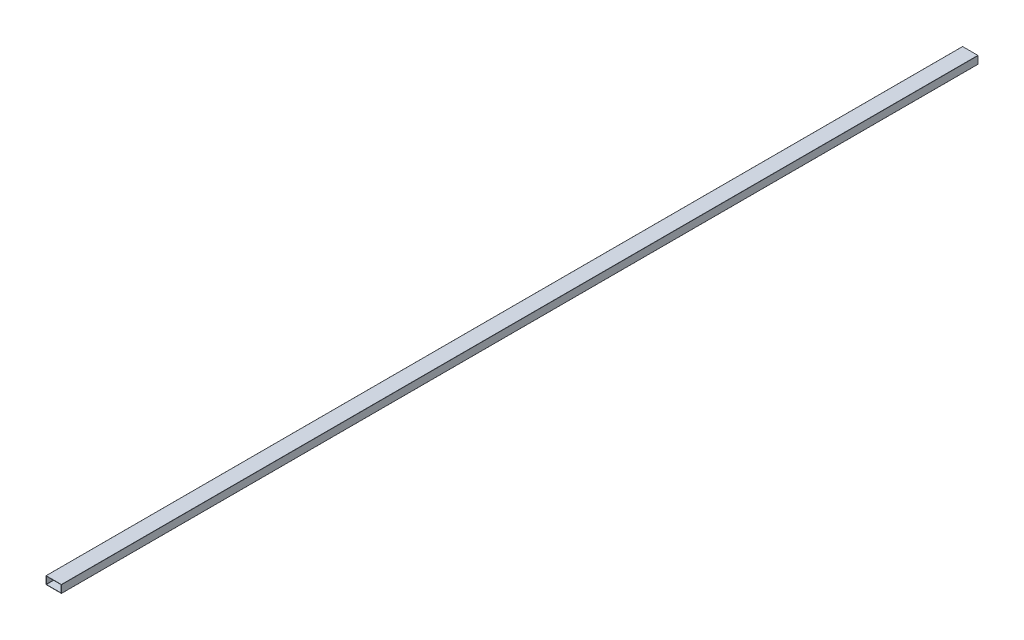
ISO-10303-21;
HEADER;
FILE_DESCRIPTION(('STEP AP214'),'2;1');
FILE_NAME('part.step','',(''),(''),'','','');
FILE_SCHEMA(('AUTOMOTIVE_DESIGN { 1 0 10303 214 1 1 1 1 }'));
ENDSEC;
DATA;
#1=APPLICATION_CONTEXT('core data for automotive mechanical design processes');
#2=APPLICATION_PROTOCOL_DEFINITION('international standard','automotive_design',2000,#1);
#3=PRODUCT_CONTEXT('',#1,'mechanical');
#4=PRODUCT('Part','Part','',(#3));
#5=PRODUCT_RELATED_PRODUCT_CATEGORY('part','',(#4));
#6=PRODUCT_DEFINITION_FORMATION('','',#4);
#7=PRODUCT_DEFINITION_CONTEXT('part definition',#1,'design');
#8=PRODUCT_DEFINITION('design','',#6,#7);
#9=PRODUCT_DEFINITION_SHAPE('','',#8);
#10=(LENGTH_UNIT() NAMED_UNIT(*) SI_UNIT(.MILLI.,.METRE.));
#11=(NAMED_UNIT(*) PLANE_ANGLE_UNIT() SI_UNIT($,.RADIAN.));
#12=(NAMED_UNIT(*) SI_UNIT($,.STERADIAN.) SOLID_ANGLE_UNIT());
#13=UNCERTAINTY_MEASURE_WITH_UNIT(LENGTH_MEASURE(1.E-05),#10,'distance_accuracy_value','');
#14=(GEOMETRIC_REPRESENTATION_CONTEXT(3) GLOBAL_UNCERTAINTY_ASSIGNED_CONTEXT((#13)) GLOBAL_UNIT_ASSIGNED_CONTEXT((#10,
#11,#12)) REPRESENTATION_CONTEXT('',''));
#15=CARTESIAN_POINT('',(0.,0.,0.));
#16=DIRECTION('',(0.,0.,1.));
#17=DIRECTION('',(1.,0.,0.));
#18=AXIS2_PLACEMENT_3D('',#15,#16,#17);
#19=CARTESIAN_POINT('',(50.8,-25.4,-6000.));
#20=DIRECTION('',(1.,0.,0.));
#21=DIRECTION('',(0.,0.,-1.));
#22=AXIS2_PLACEMENT_3D('',#19,#20,#21);
#23=PLANE('',#22);
#24=DIRECTION('',(0.,1.,0.));
#25=VECTOR('',#24,1.);
#26=CARTESIAN_POINT('',(50.8,-25.4,0.));
#27=LINE('',#26,#25);
#28=CARTESIAN_POINT('',(50.8,-24.4,0.));
#29=VERTEX_POINT('',#28);
#30=CARTESIAN_POINT('',(50.8,24.4,0.));
#31=VERTEX_POINT('',#30);
#32=EDGE_CURVE('E197',#29,#31,#27,.T.);
#33=ORIENTED_EDGE('',*,*,#32,.F.);
#34=DIRECTION('',(0.,0.,1.));
#35=VECTOR('',#34,1.);
#36=CARTESIAN_POINT('',(50.8,-24.4,-6000.));
#37=LINE('',#36,#35);
#38=CARTESIAN_POINT('',(50.8,-24.4,-6000.));
#39=VERTEX_POINT('',#38);
#40=EDGE_CURVE('E158',#29,#39,#37,.F.);
#41=ORIENTED_EDGE('',*,*,#40,.T.);
#42=DIRECTION('',(0.,1.,0.));
#43=VECTOR('',#42,1.);
#44=CARTESIAN_POINT('',(50.8,-25.4,-6000.));
#45=LINE('',#44,#43);
#46=CARTESIAN_POINT('',(50.8,24.4,-6000.));
#47=VERTEX_POINT('',#46);
#48=EDGE_CURVE('E185',#39,#47,#45,.T.);
#49=ORIENTED_EDGE('',*,*,#48,.T.);
#50=DIRECTION('',(0.,0.,1.));
#51=VECTOR('',#50,1.);
#52=CARTESIAN_POINT('',(50.8,24.4,-6000.));
#53=LINE('',#52,#51);
#54=EDGE_CURVE('E251',#47,#31,#53,.T.);
#55=ORIENTED_EDGE('',*,*,#54,.T.);
#56=EDGE_LOOP('',(#33,#41,#49,#55));
#57=FACE_BOUND('',#56,.T.);
#58=ADVANCED_FACE('F33',(#57),#23,.T.);
#59=CARTESIAN_POINT('',(-50.8,-25.4,-6000.));
#60=DIRECTION('',(0.,-1.,0.));
#61=DIRECTION('',(0.,0.,-1.));
#62=AXIS2_PLACEMENT_3D('',#59,#60,#61);
#63=PLANE('',#62);
#64=DIRECTION('',(1.,0.,0.));
#65=VECTOR('',#64,1.);
#66=CARTESIAN_POINT('',(-50.8,-25.4,0.));
#67=LINE('',#66,#65);
#68=CARTESIAN_POINT('',(-49.8,-25.4,0.));
#69=VERTEX_POINT('',#68);
#70=CARTESIAN_POINT('',(49.8,-25.4,0.));
#71=VERTEX_POINT('',#70);
#72=EDGE_CURVE('E189',#69,#71,#67,.T.);
#73=ORIENTED_EDGE('',*,*,#72,.F.);
#74=DIRECTION('',(0.,0.,1.));
#75=VECTOR('',#74,1.);
#76=CARTESIAN_POINT('',(-49.8,-25.4,-6000.));
#77=LINE('',#76,#75);
#78=CARTESIAN_POINT('',(-49.8,-25.4,-6000.));
#79=VERTEX_POINT('',#78);
#80=EDGE_CURVE('E238',#69,#79,#77,.F.);
#81=ORIENTED_EDGE('',*,*,#80,.T.);
#82=DIRECTION('',(1.,0.,0.));
#83=VECTOR('',#82,1.);
#84=CARTESIAN_POINT('',(-50.8,-25.4,-6000.));
#85=LINE('',#84,#83);
#86=CARTESIAN_POINT('',(49.8,-25.4,-6000.));
#87=VERTEX_POINT('',#86);
#88=EDGE_CURVE('E194',#79,#87,#85,.T.);
#89=ORIENTED_EDGE('',*,*,#88,.T.);
#90=DIRECTION('',(0.,0.,1.));
#91=VECTOR('',#90,1.);
#92=CARTESIAN_POINT('',(49.8,-25.4,-6000.));
#93=LINE('',#92,#91);
#94=EDGE_CURVE('E235',#87,#71,#93,.T.);
#95=ORIENTED_EDGE('',*,*,#94,.T.);
#96=EDGE_LOOP('',(#73,#81,#89,#95));
#97=FACE_BOUND('',#96,.T.);
#98=ADVANCED_FACE('F305',(#97),#63,.T.);
#99=CARTESIAN_POINT('',(-50.8,-25.4,-6000.));
#100=DIRECTION('',(-1.,0.,0.));
#101=DIRECTION('',(0.,0.,1.));
#102=AXIS2_PLACEMENT_3D('',#99,#100,#101);
#103=PLANE('',#102);
#104=DIRECTION('',(0.,-1.,0.));
#105=VECTOR('',#104,1.);
#106=CARTESIAN_POINT('',(-50.8,-25.4,-6000.));
#107=LINE('',#106,#105);
#108=CARTESIAN_POINT('',(-50.8,24.4,-6000.));
#109=VERTEX_POINT('',#108);
#110=CARTESIAN_POINT('',(-50.8,-24.4,-6000.));
#111=VERTEX_POINT('',#110);
#112=EDGE_CURVE('E191',#109,#111,#107,.T.);
#113=ORIENTED_EDGE('',*,*,#112,.T.);
#114=DIRECTION('',(0.,0.,1.));
#115=VECTOR('',#114,1.);
#116=CARTESIAN_POINT('',(-50.8,-24.4,-6000.));
#117=LINE('',#116,#115);
#118=CARTESIAN_POINT('',(-50.8,-24.4,0.));
#119=VERTEX_POINT('',#118);
#120=EDGE_CURVE('E224',#111,#119,#117,.T.);
#121=ORIENTED_EDGE('',*,*,#120,.T.);
#122=DIRECTION('',(0.,-1.,0.));
#123=VECTOR('',#122,1.);
#124=CARTESIAN_POINT('',(-50.8,-25.4,0.));
#125=LINE('',#124,#123);
#126=CARTESIAN_POINT('',(-50.8,24.4,0.));
#127=VERTEX_POINT('',#126);
#128=EDGE_CURVE('E203',#127,#119,#125,.T.);
#129=ORIENTED_EDGE('',*,*,#128,.F.);
#130=DIRECTION('',(0.,0.,1.));
#131=VECTOR('',#130,1.);
#132=CARTESIAN_POINT('',(-50.8,24.4,-6000.));
#133=LINE('',#132,#131);
#134=EDGE_CURVE('E222',#127,#109,#133,.F.);
#135=ORIENTED_EDGE('',*,*,#134,.T.);
#136=EDGE_LOOP('',(#113,#121,#129,#135));
#137=FACE_BOUND('',#136,.T.);
#138=ADVANCED_FACE('F311',(#137),#103,.T.);
#139=CARTESIAN_POINT('',(-50.8,25.4,-6000.));
#140=DIRECTION('',(0.,1.,0.));
#141=DIRECTION('',(0.,0.,1.));
#142=AXIS2_PLACEMENT_3D('',#139,#140,#141);
#143=PLANE('',#142);
#144=DIRECTION('',(-1.,0.,0.));
#145=VECTOR('',#144,1.);
#146=CARTESIAN_POINT('',(-50.8,25.4,-6000.));
#147=LINE('',#146,#145);
#148=CARTESIAN_POINT('',(49.8,25.4,-6000.));
#149=VERTEX_POINT('',#148);
#150=CARTESIAN_POINT('',(-49.8,25.4,-6000.));
#151=VERTEX_POINT('',#150);
#152=EDGE_CURVE('E188',#149,#151,#147,.T.);
#153=ORIENTED_EDGE('',*,*,#152,.T.);
#154=DIRECTION('',(0.,0.,1.));
#155=VECTOR('',#154,1.);
#156=CARTESIAN_POINT('',(-49.8,25.4,-6000.));
#157=LINE('',#156,#155);
#158=CARTESIAN_POINT('',(-49.8,25.4,0.));
#159=VERTEX_POINT('',#158);
#160=EDGE_CURVE('E248',#151,#159,#157,.T.);
#161=ORIENTED_EDGE('',*,*,#160,.T.);
#162=DIRECTION('',(-1.,0.,0.));
#163=VECTOR('',#162,1.);
#164=CARTESIAN_POINT('',(-50.8,25.4,0.));
#165=LINE('',#164,#163);
#166=CARTESIAN_POINT('',(49.8,25.4,0.));
#167=VERTEX_POINT('',#166);
#168=EDGE_CURVE('E200',#167,#159,#165,.T.);
#169=ORIENTED_EDGE('',*,*,#168,.F.);
#170=DIRECTION('',(0.,0.,1.));
#171=VECTOR('',#170,1.);
#172=CARTESIAN_POINT('',(49.8,25.4,-6000.));
#173=LINE('',#172,#171);
#174=EDGE_CURVE('E55',#167,#149,#173,.F.);
#175=ORIENTED_EDGE('',*,*,#174,.T.);
#176=EDGE_LOOP('',(#153,#161,#169,#175));
#177=FACE_BOUND('',#176,.T.);
#178=ADVANCED_FACE('F316',(#177),#143,.T.);
#179=CARTESIAN_POINT('',(0.,0.,-6000.));
#180=DIRECTION('',(0.,0.,-1.));
#181=DIRECTION('',(-1.,0.,0.));
#182=AXIS2_PLACEMENT_3D('',#179,#180,#181);
#183=PLANE('',#182);
#184=DIRECTION('',(0.,-1.,0.));
#185=VECTOR('',#184,1.);
#186=CARTESIAN_POINT('',(-48.91,-23.51,-6000.));
#187=LINE('',#186,#185);
#188=CARTESIAN_POINT('',(-48.91,22.51,-6000.));
#189=VERTEX_POINT('',#188);
#190=CARTESIAN_POINT('',(-48.91,-22.51,-6000.));
#191=VERTEX_POINT('',#190);
#192=EDGE_CURVE('E167',#189,#191,#187,.T.);
#193=ORIENTED_EDGE('',*,*,#192,.T.);
#194=CARTESIAN_POINT('',(-47.91,-22.51,-6000.));
#195=DIRECTION('',(0.,0.,-1.));
#196=DIRECTION('',(-1.,0.,0.));
#197=AXIS2_PLACEMENT_3D('',#194,#195,#196);
#198=CIRCLE('',#197,1.);
#199=CARTESIAN_POINT('',(-47.91,-23.51,-6000.));
#200=VERTEX_POINT('',#199);
#201=EDGE_CURVE('E11',#191,#200,#198,.F.);
#202=ORIENTED_EDGE('',*,*,#201,.T.);
#203=DIRECTION('',(1.,0.,0.));
#204=VECTOR('',#203,1.);
#205=CARTESIAN_POINT('',(-48.91,-23.51,-6000.));
#206=LINE('',#205,#204);
#207=CARTESIAN_POINT('',(47.91,-23.51,-6000.));
#208=VERTEX_POINT('',#207);
#209=EDGE_CURVE('E175',#200,#208,#206,.T.);
#210=ORIENTED_EDGE('',*,*,#209,.T.);
#211=CARTESIAN_POINT('',(47.91,-22.51,-6000.));
#212=DIRECTION('',(0.,0.,-1.));
#213=DIRECTION('',(-1.,0.,0.));
#214=AXIS2_PLACEMENT_3D('',#211,#212,#213);
#215=CIRCLE('',#214,1.);
#216=CARTESIAN_POINT('',(48.91,-22.51,-6000.));
#217=VERTEX_POINT('',#216);
#218=EDGE_CURVE('E262',#208,#217,#215,.F.);
#219=ORIENTED_EDGE('',*,*,#218,.T.);
#220=DIRECTION('',(0.,1.,0.));
#221=VECTOR('',#220,1.);
#222=CARTESIAN_POINT('',(48.91,-23.51,-6000.));
#223=LINE('',#222,#221);
#224=CARTESIAN_POINT('',(48.91,22.51,-6000.));
#225=VERTEX_POINT('',#224);
#226=EDGE_CURVE('E179',#217,#225,#223,.T.);
#227=ORIENTED_EDGE('',*,*,#226,.T.);
#228=CARTESIAN_POINT('',(47.91,22.51,-6000.));
#229=DIRECTION('',(0.,0.,-1.));
#230=DIRECTION('',(-1.,0.,0.));
#231=AXIS2_PLACEMENT_3D('',#228,#229,#230);
#232=CIRCLE('',#231,1.);
#233=CARTESIAN_POINT('',(47.91,23.51,-6000.));
#234=VERTEX_POINT('',#233);
#235=EDGE_CURVE('E258',#225,#234,#232,.F.);
#236=ORIENTED_EDGE('',*,*,#235,.T.);
#237=DIRECTION('',(-1.,0.,0.));
#238=VECTOR('',#237,1.);
#239=CARTESIAN_POINT('',(-48.91,23.51,-6000.));
#240=LINE('',#239,#238);
#241=CARTESIAN_POINT('',(-47.91,23.51,-6000.));
#242=VERTEX_POINT('',#241);
#243=EDGE_CURVE('E277',#234,#242,#240,.T.);
#244=ORIENTED_EDGE('',*,*,#243,.T.);
#245=CARTESIAN_POINT('',(-47.91,22.51,-6000.));
#246=DIRECTION('',(0.,0.,-1.));
#247=DIRECTION('',(-1.,0.,0.));
#248=AXIS2_PLACEMENT_3D('',#245,#246,#247);
#249=CIRCLE('',#248,1.);
#250=EDGE_CURVE('E157',#242,#189,#249,.F.);
#251=ORIENTED_EDGE('',*,*,#250,.T.);
#252=EDGE_LOOP('',(#193,#202,#210,#219,#227,#236,#244,#251));
#253=FACE_BOUND('',#252,.T.);
#254=ORIENTED_EDGE('',*,*,#88,.F.);
#255=CARTESIAN_POINT('',(-49.8,-24.4,-6000.));
#256=DIRECTION('',(0.,0.,-1.));
#257=DIRECTION('',(-1.,0.,0.));
#258=AXIS2_PLACEMENT_3D('',#255,#256,#257);
#259=CIRCLE('',#258,1.);
#260=EDGE_CURVE('E245',#79,#111,#259,.T.);
#261=ORIENTED_EDGE('',*,*,#260,.T.);
#262=ORIENTED_EDGE('',*,*,#112,.F.);
#263=CARTESIAN_POINT('',(-49.8,24.4,-6000.));
#264=DIRECTION('',(0.,0.,-1.));
#265=DIRECTION('',(-1.,0.,0.));
#266=AXIS2_PLACEMENT_3D('',#263,#264,#265);
#267=CIRCLE('',#266,1.);
#268=EDGE_CURVE('E48',#109,#151,#267,.T.);
#269=ORIENTED_EDGE('',*,*,#268,.T.);
#270=ORIENTED_EDGE('',*,*,#152,.F.);
#271=CARTESIAN_POINT('',(49.8,24.4,-6000.));
#272=DIRECTION('',(0.,0.,-1.));
#273=DIRECTION('',(-1.,0.,0.));
#274=AXIS2_PLACEMENT_3D('',#271,#272,#273);
#275=CIRCLE('',#274,1.);
#276=EDGE_CURVE('E240',#149,#47,#275,.T.);
#277=ORIENTED_EDGE('',*,*,#276,.T.);
#278=ORIENTED_EDGE('',*,*,#48,.F.);
#279=CARTESIAN_POINT('',(49.8,-24.4,-6000.));
#280=DIRECTION('',(0.,0.,-1.));
#281=DIRECTION('',(-1.,0.,0.));
#282=AXIS2_PLACEMENT_3D('',#279,#280,#281);
#283=CIRCLE('',#282,1.);
#284=EDGE_CURVE('E242',#39,#87,#283,.T.);
#285=ORIENTED_EDGE('',*,*,#284,.T.);
#286=EDGE_LOOP('',(#254,#261,#262,#269,#270,#277,#278,#285));
#287=FACE_BOUND('',#286,.T.);
#288=ADVANCED_FACE('F267',(#253,#287),#183,.T.);
#289=CARTESIAN_POINT('',(0.,0.,0.));
#290=DIRECTION('',(0.,0.,-1.));
#291=DIRECTION('',(-1.,0.,0.));
#292=AXIS2_PLACEMENT_3D('',#289,#290,#291);
#293=PLANE('',#292);
#294=DIRECTION('',(0.,1.,0.));
#295=VECTOR('',#294,1.);
#296=CARTESIAN_POINT('',(48.91,-23.51,0.));
#297=LINE('',#296,#295);
#298=CARTESIAN_POINT('',(48.91,-22.51,0.));
#299=VERTEX_POINT('',#298);
#300=CARTESIAN_POINT('',(48.91,22.51,0.));
#301=VERTEX_POINT('',#300);
#302=EDGE_CURVE('E181',#299,#301,#297,.T.);
#303=ORIENTED_EDGE('',*,*,#302,.F.);
#304=CARTESIAN_POINT('',(47.91,-22.51,0.));
#305=DIRECTION('',(0.,0.,-1.));
#306=DIRECTION('',(-1.,0.,0.));
#307=AXIS2_PLACEMENT_3D('',#304,#305,#306);
#308=CIRCLE('',#307,1.);
#309=CARTESIAN_POINT('',(47.91,-23.51,0.));
#310=VERTEX_POINT('',#309);
#311=EDGE_CURVE('E260',#299,#310,#308,.T.);
#312=ORIENTED_EDGE('',*,*,#311,.T.);
#313=DIRECTION('',(1.,0.,0.));
#314=VECTOR('',#313,1.);
#315=CARTESIAN_POINT('',(-48.91,-23.51,0.));
#316=LINE('',#315,#314);
#317=CARTESIAN_POINT('',(-47.91,-23.51,0.));
#318=VERTEX_POINT('',#317);
#319=EDGE_CURVE('E281',#318,#310,#316,.T.);
#320=ORIENTED_EDGE('',*,*,#319,.F.);
#321=CARTESIAN_POINT('',(-47.91,-22.51,0.));
#322=DIRECTION('',(0.,0.,-1.));
#323=DIRECTION('',(-1.,0.,0.));
#324=AXIS2_PLACEMENT_3D('',#321,#322,#323);
#325=CIRCLE('',#324,1.);
#326=CARTESIAN_POINT('',(-48.91,-22.51,0.));
#327=VERTEX_POINT('',#326);
#328=EDGE_CURVE('E41',#318,#327,#325,.T.);
#329=ORIENTED_EDGE('',*,*,#328,.T.);
#330=DIRECTION('',(0.,-1.,0.));
#331=VECTOR('',#330,1.);
#332=CARTESIAN_POINT('',(-48.91,-23.51,0.));
#333=LINE('',#332,#331);
#334=CARTESIAN_POINT('',(-48.91,22.51,0.));
#335=VERTEX_POINT('',#334);
#336=EDGE_CURVE('E164',#335,#327,#333,.T.);
#337=ORIENTED_EDGE('',*,*,#336,.F.);
#338=CARTESIAN_POINT('',(-47.91,22.51,0.));
#339=DIRECTION('',(0.,0.,-1.));
#340=DIRECTION('',(-1.,0.,0.));
#341=AXIS2_PLACEMENT_3D('',#338,#339,#340);
#342=CIRCLE('',#341,1.);
#343=CARTESIAN_POINT('',(-47.91,23.51,0.));
#344=VERTEX_POINT('',#343);
#345=EDGE_CURVE('E147',#335,#344,#342,.T.);
#346=ORIENTED_EDGE('',*,*,#345,.T.);
#347=DIRECTION('',(-1.,0.,0.));
#348=VECTOR('',#347,1.);
#349=CARTESIAN_POINT('',(-48.91,23.51,0.));
#350=LINE('',#349,#348);
#351=CARTESIAN_POINT('',(47.91,23.51,0.));
#352=VERTEX_POINT('',#351);
#353=EDGE_CURVE('E176',#352,#344,#350,.T.);
#354=ORIENTED_EDGE('',*,*,#353,.F.);
#355=CARTESIAN_POINT('',(47.91,22.51,0.));
#356=DIRECTION('',(0.,0.,-1.));
#357=DIRECTION('',(-1.,0.,0.));
#358=AXIS2_PLACEMENT_3D('',#355,#356,#357);
#359=CIRCLE('',#358,1.);
#360=EDGE_CURVE('E256',#352,#301,#359,.T.);
#361=ORIENTED_EDGE('',*,*,#360,.T.);
#362=EDGE_LOOP('',(#303,#312,#320,#329,#337,#346,#354,#361));
#363=FACE_BOUND('',#362,.T.);
#364=ORIENTED_EDGE('',*,*,#128,.T.);
#365=CARTESIAN_POINT('',(-49.8,-24.4,0.));
#366=DIRECTION('',(0.,0.,-1.));
#367=DIRECTION('',(-1.,0.,0.));
#368=AXIS2_PLACEMENT_3D('',#365,#366,#367);
#369=CIRCLE('',#368,1.);
#370=EDGE_CURVE('E233',#119,#69,#369,.F.);
#371=ORIENTED_EDGE('',*,*,#370,.T.);
#372=ORIENTED_EDGE('',*,*,#72,.T.);
#373=CARTESIAN_POINT('',(49.8,-24.4,0.));
#374=DIRECTION('',(0.,0.,-1.));
#375=DIRECTION('',(-1.,0.,0.));
#376=AXIS2_PLACEMENT_3D('',#373,#374,#375);
#377=CIRCLE('',#376,1.);
#378=EDGE_CURVE('E229',#71,#29,#377,.F.);
#379=ORIENTED_EDGE('',*,*,#378,.T.);
#380=ORIENTED_EDGE('',*,*,#32,.T.);
#381=CARTESIAN_POINT('',(49.8,24.4,0.));
#382=DIRECTION('',(0.,0.,-1.));
#383=DIRECTION('',(-1.,0.,0.));
#384=AXIS2_PLACEMENT_3D('',#381,#382,#383);
#385=CIRCLE('',#384,1.);
#386=EDGE_CURVE('E227',#31,#167,#385,.F.);
#387=ORIENTED_EDGE('',*,*,#386,.T.);
#388=ORIENTED_EDGE('',*,*,#168,.T.);
#389=CARTESIAN_POINT('',(-49.8,24.4,0.));
#390=DIRECTION('',(0.,0.,-1.));
#391=DIRECTION('',(-1.,0.,0.));
#392=AXIS2_PLACEMENT_3D('',#389,#390,#391);
#393=CIRCLE('',#392,1.);
#394=EDGE_CURVE('E231',#159,#127,#393,.F.);
#395=ORIENTED_EDGE('',*,*,#394,.T.);
#396=EDGE_LOOP('',(#364,#371,#372,#379,#380,#387,#388,#395));
#397=FACE_BOUND('',#396,.T.);
#398=ADVANCED_FACE('F172',(#363,#397),#293,.F.);
#399=CARTESIAN_POINT('',(-48.91,-23.51,-6000.));
#400=DIRECTION('',(0.,-1.,0.));
#401=DIRECTION('',(0.,0.,-1.));
#402=AXIS2_PLACEMENT_3D('',#399,#400,#401);
#403=PLANE('',#402);
#404=ORIENTED_EDGE('',*,*,#319,.T.);
#405=DIRECTION('',(0.,0.,1.));
#406=VECTOR('',#405,1.);
#407=CARTESIAN_POINT('',(47.91,-23.51,-6000.));
#408=LINE('',#407,#406);
#409=EDGE_CURVE('E220',#310,#208,#408,.F.);
#410=ORIENTED_EDGE('',*,*,#409,.T.);
#411=ORIENTED_EDGE('',*,*,#209,.F.);
#412=DIRECTION('',(0.,0.,1.));
#413=VECTOR('',#412,1.);
#414=CARTESIAN_POINT('',(-47.91,-23.51,0.));
#415=LINE('',#414,#413);
#416=EDGE_CURVE('E217',#200,#318,#415,.T.);
#417=ORIENTED_EDGE('',*,*,#416,.T.);
#418=EDGE_LOOP('',(#404,#410,#411,#417));
#419=FACE_BOUND('',#418,.T.);
#420=ADVANCED_FACE('F283',(#419),#403,.F.);
#421=CARTESIAN_POINT('',(-48.91,-23.51,-6000.));
#422=DIRECTION('',(-1.,0.,0.));
#423=DIRECTION('',(0.,0.,1.));
#424=AXIS2_PLACEMENT_3D('',#421,#422,#423);
#425=PLANE('',#424);
#426=ORIENTED_EDGE('',*,*,#192,.F.);
#427=DIRECTION('',(0.,0.,1.));
#428=VECTOR('',#427,1.);
#429=CARTESIAN_POINT('',(-48.91,22.51,0.));
#430=LINE('',#429,#428);
#431=EDGE_CURVE('E151',#189,#335,#430,.T.);
#432=ORIENTED_EDGE('',*,*,#431,.T.);
#433=ORIENTED_EDGE('',*,*,#336,.T.);
#434=DIRECTION('',(0.,0.,1.));
#435=VECTOR('',#434,1.);
#436=CARTESIAN_POINT('',(-48.91,-22.51,-6000.));
#437=LINE('',#436,#435);
#438=EDGE_CURVE('E169',#327,#191,#437,.F.);
#439=ORIENTED_EDGE('',*,*,#438,.T.);
#440=EDGE_LOOP('',(#426,#432,#433,#439));
#441=FACE_BOUND('',#440,.T.);
#442=ADVANCED_FACE('F163',(#441),#425,.F.);
#443=CARTESIAN_POINT('',(-48.91,23.51,-6000.));
#444=DIRECTION('',(0.,1.,0.));
#445=DIRECTION('',(0.,0.,1.));
#446=AXIS2_PLACEMENT_3D('',#443,#444,#445);
#447=PLANE('',#446);
#448=ORIENTED_EDGE('',*,*,#353,.T.);
#449=DIRECTION('',(0.,0.,1.));
#450=VECTOR('',#449,1.);
#451=CARTESIAN_POINT('',(-47.91,23.51,-6000.));
#452=LINE('',#451,#450);
#453=EDGE_CURVE('E152',#344,#242,#452,.F.);
#454=ORIENTED_EDGE('',*,*,#453,.T.);
#455=ORIENTED_EDGE('',*,*,#243,.F.);
#456=DIRECTION('',(0.,0.,1.));
#457=VECTOR('',#456,1.);
#458=CARTESIAN_POINT('',(47.91,23.51,0.));
#459=LINE('',#458,#457);
#460=EDGE_CURVE('E168',#234,#352,#459,.T.);
#461=ORIENTED_EDGE('',*,*,#460,.T.);
#462=EDGE_LOOP('',(#448,#454,#455,#461));
#463=FACE_BOUND('',#462,.T.);
#464=ADVANCED_FACE('F292',(#463),#447,.F.);
#465=CARTESIAN_POINT('',(48.91,-23.51,-6000.));
#466=DIRECTION('',(1.,0.,0.));
#467=DIRECTION('',(0.,0.,-1.));
#468=AXIS2_PLACEMENT_3D('',#465,#466,#467);
#469=PLANE('',#468);
#470=ORIENTED_EDGE('',*,*,#302,.T.);
#471=DIRECTION('',(0.,0.,1.));
#472=VECTOR('',#471,1.);
#473=CARTESIAN_POINT('',(48.91,22.51,-6000.));
#474=LINE('',#473,#472);
#475=EDGE_CURVE('E215',#301,#225,#474,.F.);
#476=ORIENTED_EDGE('',*,*,#475,.T.);
#477=ORIENTED_EDGE('',*,*,#226,.F.);
#478=DIRECTION('',(0.,0.,1.));
#479=VECTOR('',#478,1.);
#480=CARTESIAN_POINT('',(48.91,-22.51,0.));
#481=LINE('',#480,#479);
#482=EDGE_CURVE('E212',#217,#299,#481,.T.);
#483=ORIENTED_EDGE('',*,*,#482,.T.);
#484=EDGE_LOOP('',(#470,#476,#477,#483));
#485=FACE_BOUND('',#484,.T.);
#486=ADVANCED_FACE('F275',(#485),#469,.F.);
#487=CARTESIAN_POINT('',(-47.91,22.51,-6000.));
#488=DIRECTION('',(0.,0.,-1.));
#489=DIRECTION('',(-1.,0.,0.));
#490=AXIS2_PLACEMENT_3D('',#487,#488,#489);
#491=CYLINDRICAL_SURFACE('',#490,1.);
#492=ORIENTED_EDGE('',*,*,#250,.F.);
#493=ORIENTED_EDGE('',*,*,#453,.F.);
#494=ORIENTED_EDGE('',*,*,#345,.F.);
#495=ORIENTED_EDGE('',*,*,#431,.F.);
#496=EDGE_LOOP('',(#492,#493,#494,#495));
#497=FACE_BOUND('',#496,.T.);
#498=ADVANCED_FACE('F150',(#497),#491,.F.);
#499=CARTESIAN_POINT('',(47.91,22.51,-6000.));
#500=DIRECTION('',(0.,0.,-1.));
#501=DIRECTION('',(-1.,0.,0.));
#502=AXIS2_PLACEMENT_3D('',#499,#500,#501);
#503=CYLINDRICAL_SURFACE('',#502,1.);
#504=ORIENTED_EDGE('',*,*,#235,.F.);
#505=ORIENTED_EDGE('',*,*,#475,.F.);
#506=ORIENTED_EDGE('',*,*,#360,.F.);
#507=ORIENTED_EDGE('',*,*,#460,.F.);
#508=EDGE_LOOP('',(#504,#505,#506,#507));
#509=FACE_BOUND('',#508,.T.);
#510=ADVANCED_FACE('F294',(#509),#503,.F.);
#511=CARTESIAN_POINT('',(47.91,-22.51,-6000.));
#512=DIRECTION('',(0.,0.,-1.));
#513=DIRECTION('',(-1.,0.,0.));
#514=AXIS2_PLACEMENT_3D('',#511,#512,#513);
#515=CYLINDRICAL_SURFACE('',#514,1.);
#516=ORIENTED_EDGE('',*,*,#218,.F.);
#517=ORIENTED_EDGE('',*,*,#409,.F.);
#518=ORIENTED_EDGE('',*,*,#311,.F.);
#519=ORIENTED_EDGE('',*,*,#482,.F.);
#520=EDGE_LOOP('',(#516,#517,#518,#519));
#521=FACE_BOUND('',#520,.T.);
#522=ADVANCED_FACE('F279',(#521),#515,.F.);
#523=CARTESIAN_POINT('',(-49.8,-24.4,-6000.));
#524=DIRECTION('',(0.,0.,1.));
#525=DIRECTION('',(1.,0.,0.));
#526=AXIS2_PLACEMENT_3D('',#523,#524,#525);
#527=CYLINDRICAL_SURFACE('',#526,1.);
#528=ORIENTED_EDGE('',*,*,#260,.F.);
#529=ORIENTED_EDGE('',*,*,#80,.F.);
#530=ORIENTED_EDGE('',*,*,#370,.F.);
#531=ORIENTED_EDGE('',*,*,#120,.F.);
#532=EDGE_LOOP('',(#528,#529,#530,#531));
#533=FACE_BOUND('',#532,.T.);
#534=ADVANCED_FACE('F301',(#533),#527,.T.);
#535=CARTESIAN_POINT('',(-49.8,24.4,-6000.));
#536=DIRECTION('',(0.,0.,1.));
#537=DIRECTION('',(1.,0.,0.));
#538=AXIS2_PLACEMENT_3D('',#535,#536,#537);
#539=CYLINDRICAL_SURFACE('',#538,1.);
#540=ORIENTED_EDGE('',*,*,#268,.F.);
#541=ORIENTED_EDGE('',*,*,#134,.F.);
#542=ORIENTED_EDGE('',*,*,#394,.F.);
#543=ORIENTED_EDGE('',*,*,#160,.F.);
#544=EDGE_LOOP('',(#540,#541,#542,#543));
#545=FACE_BOUND('',#544,.T.);
#546=ADVANCED_FACE('F368',(#545),#539,.T.);
#547=CARTESIAN_POINT('',(-47.91,-22.51,-6000.));
#548=DIRECTION('',(0.,0.,-1.));
#549=DIRECTION('',(-1.,0.,0.));
#550=AXIS2_PLACEMENT_3D('',#547,#548,#549);
#551=CYLINDRICAL_SURFACE('',#550,1.);
#552=ORIENTED_EDGE('',*,*,#201,.F.);
#553=ORIENTED_EDGE('',*,*,#438,.F.);
#554=ORIENTED_EDGE('',*,*,#328,.F.);
#555=ORIENTED_EDGE('',*,*,#416,.F.);
#556=EDGE_LOOP('',(#552,#553,#554,#555));
#557=FACE_BOUND('',#556,.T.);
#558=ADVANCED_FACE('F378',(#557),#551,.F.);
#559=CARTESIAN_POINT('',(49.8,-24.4,-6000.));
#560=DIRECTION('',(0.,0.,1.));
#561=DIRECTION('',(1.,0.,0.));
#562=AXIS2_PLACEMENT_3D('',#559,#560,#561);
#563=CYLINDRICAL_SURFACE('',#562,1.);
#564=ORIENTED_EDGE('',*,*,#284,.F.);
#565=ORIENTED_EDGE('',*,*,#40,.F.);
#566=ORIENTED_EDGE('',*,*,#378,.F.);
#567=ORIENTED_EDGE('',*,*,#94,.F.);
#568=EDGE_LOOP('',(#564,#565,#566,#567));
#569=FACE_BOUND('',#568,.T.);
#570=ADVANCED_FACE('F388',(#569),#563,.T.);
#571=CARTESIAN_POINT('',(49.8,24.4,-6000.));
#572=DIRECTION('',(0.,0.,1.));
#573=DIRECTION('',(1.,0.,0.));
#574=AXIS2_PLACEMENT_3D('',#571,#572,#573);
#575=CYLINDRICAL_SURFACE('',#574,1.);
#576=ORIENTED_EDGE('',*,*,#276,.F.);
#577=ORIENTED_EDGE('',*,*,#174,.F.);
#578=ORIENTED_EDGE('',*,*,#386,.F.);
#579=ORIENTED_EDGE('',*,*,#54,.F.);
#580=EDGE_LOOP('',(#576,#577,#578,#579));
#581=FACE_BOUND('',#580,.T.);
#582=ADVANCED_FACE('F35',(#581),#575,.T.);
#583=CLOSED_SHELL('',(#58,#98,#138,#178,#288,#398,#420,#442,#464,#486,#498,#510,#522,#534,#546,
#558,#570,#582));
#584=MANIFOLD_SOLID_BREP('B2',#583);
#585=ADVANCED_BREP_SHAPE_REPRESENTATION('',(#18,#584),#14);
#586=SHAPE_DEFINITION_REPRESENTATION(#9,#585);
ENDSEC;
END-ISO-10303-21;
